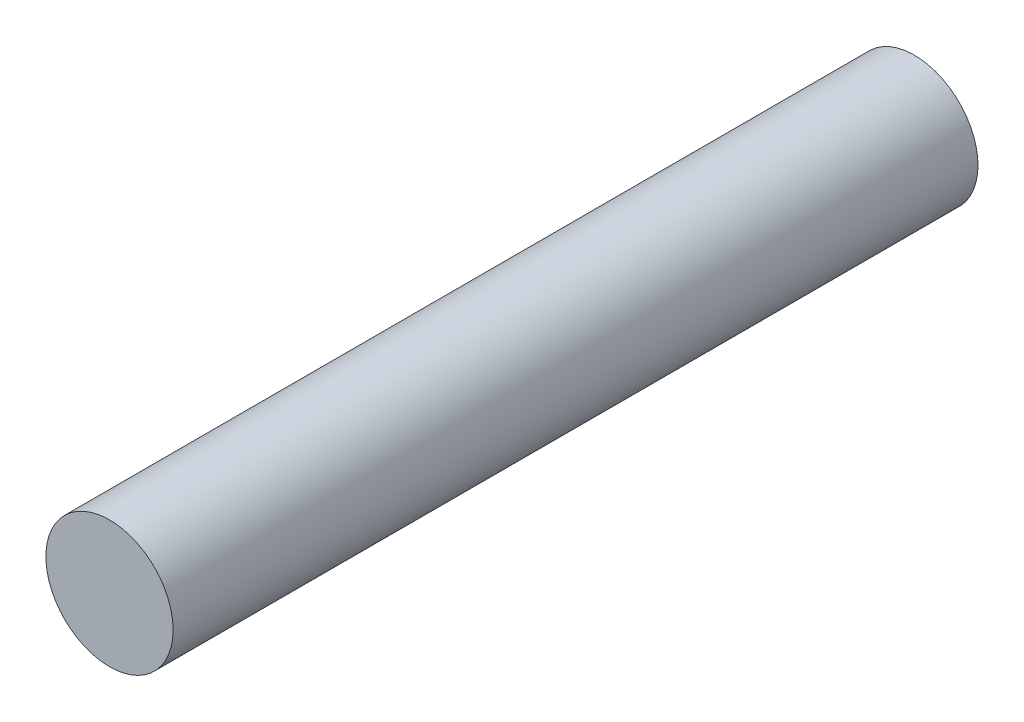
ISO-10303-21;
HEADER;
FILE_DESCRIPTION(('STEP AP214'),'2;1');
FILE_NAME('part.step','',(''),(''),'','','');
FILE_SCHEMA(('AUTOMOTIVE_DESIGN { 1 0 10303 214 1 1 1 1 }'));
ENDSEC;
DATA;
#1=APPLICATION_CONTEXT('core data for automotive mechanical design processes');
#2=APPLICATION_PROTOCOL_DEFINITION('international standard','automotive_design',2000,#1);
#3=PRODUCT_CONTEXT('',#1,'mechanical');
#4=PRODUCT('Part','Part','',(#3));
#5=PRODUCT_RELATED_PRODUCT_CATEGORY('part','',(#4));
#6=PRODUCT_DEFINITION_FORMATION('','',#4);
#7=PRODUCT_DEFINITION_CONTEXT('part definition',#1,'design');
#8=PRODUCT_DEFINITION('design','',#6,#7);
#9=PRODUCT_DEFINITION_SHAPE('','',#8);
#10=(LENGTH_UNIT() NAMED_UNIT(*) SI_UNIT(.MILLI.,.METRE.));
#11=(NAMED_UNIT(*) PLANE_ANGLE_UNIT() SI_UNIT($,.RADIAN.));
#12=(NAMED_UNIT(*) SI_UNIT($,.STERADIAN.) SOLID_ANGLE_UNIT());
#13=UNCERTAINTY_MEASURE_WITH_UNIT(LENGTH_MEASURE(1.E-05),#10,'distance_accuracy_value','');
#14=(GEOMETRIC_REPRESENTATION_CONTEXT(3) GLOBAL_UNCERTAINTY_ASSIGNED_CONTEXT((#13)) GLOBAL_UNIT_ASSIGNED_CONTEXT((#10,
#11,#12)) REPRESENTATION_CONTEXT('',''));
#15=CARTESIAN_POINT('',(0.,0.,0.));
#16=DIRECTION('',(0.,0.,1.));
#17=DIRECTION('',(1.,0.,0.));
#18=AXIS2_PLACEMENT_3D('',#15,#16,#17);
#19=CARTESIAN_POINT('',(0.,0.,31.));
#20=DIRECTION('',(0.,0.,-1.));
#21=DIRECTION('',(-1.,0.,0.));
#22=AXIS2_PLACEMENT_3D('',#19,#20,#21);
#23=CYLINDRICAL_SURFACE('',#22,2.45);
#24=CARTESIAN_POINT('',(0.,0.,31.));
#25=DIRECTION('',(0.,0.,1.));
#26=DIRECTION('',(1.,0.,0.));
#27=AXIS2_PLACEMENT_3D('',#24,#25,#26);
#28=CIRCLE('',#27,2.45);
#29=CARTESIAN_POINT('',(2.45,0.,31.));
#30=VERTEX_POINT('',#29);
#31=EDGE_CURVE('E10',#30,#30,#28,.T.);
#32=ORIENTED_EDGE('',*,*,#31,.F.);
#33=EDGE_LOOP('',(#32));
#34=FACE_BOUND('',#33,.T.);
#35=CARTESIAN_POINT('',(0.,0.,0.));
#36=DIRECTION('',(0.,0.,1.));
#37=DIRECTION('',(1.,0.,0.));
#38=AXIS2_PLACEMENT_3D('',#35,#36,#37);
#39=CIRCLE('',#38,2.45);
#40=CARTESIAN_POINT('',(2.45,0.,0.));
#41=VERTEX_POINT('',#40);
#42=EDGE_CURVE('E40',#41,#41,#39,.T.);
#43=ORIENTED_EDGE('',*,*,#42,.T.);
#44=EDGE_LOOP('',(#43));
#45=FACE_BOUND('',#44,.T.);
#46=ADVANCED_FACE('F37',(#34,#45),#23,.T.);
#47=CARTESIAN_POINT('',(0.,0.,31.));
#48=DIRECTION('',(0.,0.,1.));
#49=DIRECTION('',(1.,0.,0.));
#50=AXIS2_PLACEMENT_3D('',#47,#48,#49);
#51=PLANE('',#50);
#52=ORIENTED_EDGE('',*,*,#31,.T.);
#53=EDGE_LOOP('',(#52));
#54=FACE_BOUND('',#53,.T.);
#55=ADVANCED_FACE('F52',(#54),#51,.T.);
#56=CARTESIAN_POINT('',(0.,0.,0.));
#57=DIRECTION('',(0.,0.,1.));
#58=DIRECTION('',(1.,0.,0.));
#59=AXIS2_PLACEMENT_3D('',#56,#57,#58);
#60=PLANE('',#59);
#61=ORIENTED_EDGE('',*,*,#42,.F.);
#62=EDGE_LOOP('',(#61));
#63=FACE_BOUND('',#62,.T.);
#64=ADVANCED_FACE('F50',(#63),#60,.F.);
#65=CLOSED_SHELL('',(#46,#55,#64));
#66=MANIFOLD_SOLID_BREP('B2',#65);
#67=ADVANCED_BREP_SHAPE_REPRESENTATION('',(#18,#66),#14);
#68=SHAPE_DEFINITION_REPRESENTATION(#9,#67);
ENDSEC;
END-ISO-10303-21;
